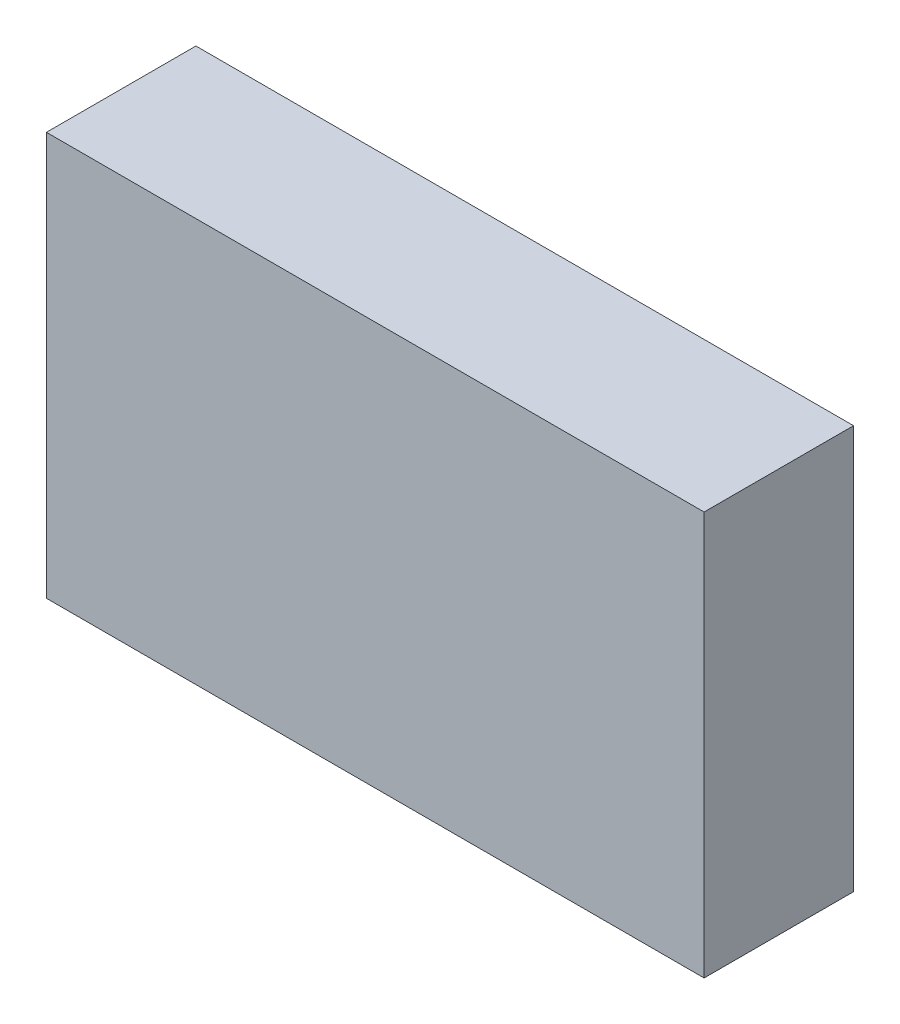
ISO-10303-21;
HEADER;
FILE_DESCRIPTION(('STEP AP214'),'2;1');
FILE_NAME('part.step','',(''),(''),'','','');
FILE_SCHEMA(('AUTOMOTIVE_DESIGN { 1 0 10303 214 1 1 1 1 }'));
ENDSEC;
DATA;
#1=APPLICATION_CONTEXT('core data for automotive mechanical design processes');
#2=APPLICATION_PROTOCOL_DEFINITION('international standard','automotive_design',2000,#1);
#3=PRODUCT_CONTEXT('',#1,'mechanical');
#4=PRODUCT('Part','Part','',(#3));
#5=PRODUCT_RELATED_PRODUCT_CATEGORY('part','',(#4));
#6=PRODUCT_DEFINITION_FORMATION('','',#4);
#7=PRODUCT_DEFINITION_CONTEXT('part definition',#1,'design');
#8=PRODUCT_DEFINITION('design','',#6,#7);
#9=PRODUCT_DEFINITION_SHAPE('','',#8);
#10=(LENGTH_UNIT() NAMED_UNIT(*) SI_UNIT(.MILLI.,.METRE.));
#11=(NAMED_UNIT(*) PLANE_ANGLE_UNIT() SI_UNIT($,.RADIAN.));
#12=(NAMED_UNIT(*) SI_UNIT($,.STERADIAN.) SOLID_ANGLE_UNIT());
#13=UNCERTAINTY_MEASURE_WITH_UNIT(LENGTH_MEASURE(1.E-05),#10,'distance_accuracy_value','');
#14=(GEOMETRIC_REPRESENTATION_CONTEXT(3) GLOBAL_UNCERTAINTY_ASSIGNED_CONTEXT((#13)) GLOBAL_UNIT_ASSIGNED_CONTEXT((#10,
#11,#12)) REPRESENTATION_CONTEXT('',''));
#15=CARTESIAN_POINT('',(0.,0.,0.));
#16=DIRECTION('',(0.,0.,1.));
#17=DIRECTION('',(1.,0.,0.));
#18=AXIS2_PLACEMENT_3D('',#15,#16,#17);
#19=CARTESIAN_POINT('',(2.21,-1.36,0.));
#20=DIRECTION('',(0.,0.,-1.));
#21=DIRECTION('',(-1.,0.,0.));
#22=AXIS2_PLACEMENT_3D('',#19,#20,#21);
#23=PLANE('',#22);
#24=DIRECTION('',(0.,-1.,0.));
#25=VECTOR('',#24,1.);
#26=CARTESIAN_POINT('',(-2.2,0.,0.));
#27=LINE('',#26,#25);
#28=CARTESIAN_POINT('',(-2.2,1.35,0.));
#29=VERTEX_POINT('',#28);
#30=CARTESIAN_POINT('',(-2.2,-1.35,0.));
#31=VERTEX_POINT('',#30);
#32=EDGE_CURVE('E68',#29,#31,#27,.T.);
#33=ORIENTED_EDGE('',*,*,#32,.F.);
#34=DIRECTION('',(-1.,0.,0.));
#35=VECTOR('',#34,1.);
#36=CARTESIAN_POINT('',(0.,1.35,0.));
#37=LINE('',#36,#35);
#38=CARTESIAN_POINT('',(2.2,1.35,0.));
#39=VERTEX_POINT('',#38);
#40=EDGE_CURVE('E55',#39,#29,#37,.T.);
#41=ORIENTED_EDGE('',*,*,#40,.F.);
#42=DIRECTION('',(0.,1.,0.));
#43=VECTOR('',#42,1.);
#44=CARTESIAN_POINT('',(2.2,0.,0.));
#45=LINE('',#44,#43);
#46=CARTESIAN_POINT('',(2.2,-1.35,0.));
#47=VERTEX_POINT('',#46);
#48=EDGE_CURVE('E20',#47,#39,#45,.T.);
#49=ORIENTED_EDGE('',*,*,#48,.F.);
#50=DIRECTION('',(1.,0.,0.));
#51=VECTOR('',#50,1.);
#52=CARTESIAN_POINT('',(0.,-1.35,0.));
#53=LINE('',#52,#51);
#54=EDGE_CURVE('E80',#31,#47,#53,.T.);
#55=ORIENTED_EDGE('',*,*,#54,.F.);
#56=EDGE_LOOP('',(#33,#41,#49,#55));
#57=FACE_BOUND('',#56,.T.);
#58=ADVANCED_FACE('F16',(#57),#23,.T.);
#59=CARTESIAN_POINT('',(2.2,-1.36,1.01));
#60=DIRECTION('',(1.,0.,0.));
#61=DIRECTION('',(0.,0.,-1.));
#62=AXIS2_PLACEMENT_3D('',#59,#60,#61);
#63=PLANE('',#62);
#64=DIRECTION('',(0.,0.,-1.));
#65=VECTOR('',#64,1.);
#66=CARTESIAN_POINT('',(2.2,1.35,0.5));
#67=LINE('',#66,#65);
#68=CARTESIAN_POINT('',(2.2,1.35,1.));
#69=VERTEX_POINT('',#68);
#70=EDGE_CURVE('E61',#69,#39,#67,.T.);
#71=ORIENTED_EDGE('',*,*,#70,.F.);
#72=DIRECTION('',(0.,1.,0.));
#73=VECTOR('',#72,1.);
#74=CARTESIAN_POINT('',(2.2,0.,1.));
#75=LINE('',#74,#73);
#76=CARTESIAN_POINT('',(2.2,-1.35,1.));
#77=VERTEX_POINT('',#76);
#78=EDGE_CURVE('E83',#77,#69,#75,.T.);
#79=ORIENTED_EDGE('',*,*,#78,.F.);
#80=DIRECTION('',(0.,0.,1.));
#81=VECTOR('',#80,1.);
#82=CARTESIAN_POINT('',(2.2,-1.35,0.5));
#83=LINE('',#82,#81);
#84=EDGE_CURVE('E64',#47,#77,#83,.T.);
#85=ORIENTED_EDGE('',*,*,#84,.F.);
#86=ORIENTED_EDGE('',*,*,#48,.T.);
#87=EDGE_LOOP('',(#71,#79,#85,#86));
#88=FACE_BOUND('',#87,.T.);
#89=ADVANCED_FACE('F60',(#88),#63,.T.);
#90=CARTESIAN_POINT('',(-2.21,1.35,-0.01));
#91=DIRECTION('',(0.,1.,0.));
#92=DIRECTION('',(0.,0.,1.));
#93=AXIS2_PLACEMENT_3D('',#90,#91,#92);
#94=PLANE('',#93);
#95=DIRECTION('',(0.,0.,-1.));
#96=VECTOR('',#95,1.);
#97=CARTESIAN_POINT('',(-2.2,1.35,0.5));
#98=LINE('',#97,#96);
#99=CARTESIAN_POINT('',(-2.2,1.35,1.));
#100=VERTEX_POINT('',#99);
#101=EDGE_CURVE('E70',#100,#29,#98,.T.);
#102=ORIENTED_EDGE('',*,*,#101,.F.);
#103=DIRECTION('',(-1.,0.,0.));
#104=VECTOR('',#103,1.);
#105=CARTESIAN_POINT('',(0.,1.35,1.));
#106=LINE('',#105,#104);
#107=EDGE_CURVE('E74',#69,#100,#106,.T.);
#108=ORIENTED_EDGE('',*,*,#107,.F.);
#109=ORIENTED_EDGE('',*,*,#70,.T.);
#110=ORIENTED_EDGE('',*,*,#40,.T.);
#111=EDGE_LOOP('',(#102,#108,#109,#110));
#112=FACE_BOUND('',#111,.T.);
#113=ADVANCED_FACE('F72',(#112),#94,.T.);
#114=CARTESIAN_POINT('',(-2.2,-1.36,-0.01));
#115=DIRECTION('',(-1.,0.,0.));
#116=DIRECTION('',(0.,0.,1.));
#117=AXIS2_PLACEMENT_3D('',#114,#115,#116);
#118=PLANE('',#117);
#119=DIRECTION('',(0.,0.,-1.));
#120=VECTOR('',#119,1.);
#121=CARTESIAN_POINT('',(-2.2,-1.35,0.5));
#122=LINE('',#121,#120);
#123=CARTESIAN_POINT('',(-2.2,-1.35,1.));
#124=VERTEX_POINT('',#123);
#125=EDGE_CURVE('E35',#124,#31,#122,.T.);
#126=ORIENTED_EDGE('',*,*,#125,.F.);
#127=DIRECTION('',(0.,-1.,0.));
#128=VECTOR('',#127,1.);
#129=CARTESIAN_POINT('',(-2.2,0.,1.));
#130=LINE('',#129,#128);
#131=EDGE_CURVE('E26',#100,#124,#130,.T.);
#132=ORIENTED_EDGE('',*,*,#131,.F.);
#133=ORIENTED_EDGE('',*,*,#101,.T.);
#134=ORIENTED_EDGE('',*,*,#32,.T.);
#135=EDGE_LOOP('',(#126,#132,#133,#134));
#136=FACE_BOUND('',#135,.T.);
#137=ADVANCED_FACE('F88',(#136),#118,.T.);
#138=CARTESIAN_POINT('',(-2.21,-1.35,1.01));
#139=DIRECTION('',(0.,-1.,0.));
#140=DIRECTION('',(0.,0.,-1.));
#141=AXIS2_PLACEMENT_3D('',#138,#139,#140);
#142=PLANE('',#141);
#143=ORIENTED_EDGE('',*,*,#84,.T.);
#144=DIRECTION('',(1.,0.,0.));
#145=VECTOR('',#144,1.);
#146=CARTESIAN_POINT('',(0.,-1.35,1.));
#147=LINE('',#146,#145);
#148=EDGE_CURVE('E11',#124,#77,#147,.T.);
#149=ORIENTED_EDGE('',*,*,#148,.F.);
#150=ORIENTED_EDGE('',*,*,#125,.T.);
#151=ORIENTED_EDGE('',*,*,#54,.T.);
#152=EDGE_LOOP('',(#143,#149,#150,#151));
#153=FACE_BOUND('',#152,.T.);
#154=ADVANCED_FACE('F90',(#153),#142,.T.);
#155=CARTESIAN_POINT('',(-2.21,-1.36,1.));
#156=DIRECTION('',(0.,0.,1.));
#157=DIRECTION('',(1.,0.,0.));
#158=AXIS2_PLACEMENT_3D('',#155,#156,#157);
#159=PLANE('',#158);
#160=ORIENTED_EDGE('',*,*,#131,.T.);
#161=ORIENTED_EDGE('',*,*,#148,.T.);
#162=ORIENTED_EDGE('',*,*,#78,.T.);
#163=ORIENTED_EDGE('',*,*,#107,.T.);
#164=EDGE_LOOP('',(#160,#161,#162,#163));
#165=FACE_BOUND('',#164,.T.);
#166=ADVANCED_FACE('F18',(#165),#159,.T.);
#167=CLOSED_SHELL('',(#58,#89,#113,#137,#154,#166));
#168=MANIFOLD_SOLID_BREP('B1',#167);
#169=ADVANCED_BREP_SHAPE_REPRESENTATION('',(#18,#168),#14);
#170=SHAPE_DEFINITION_REPRESENTATION(#9,#169);
ENDSEC;
END-ISO-10303-21;
